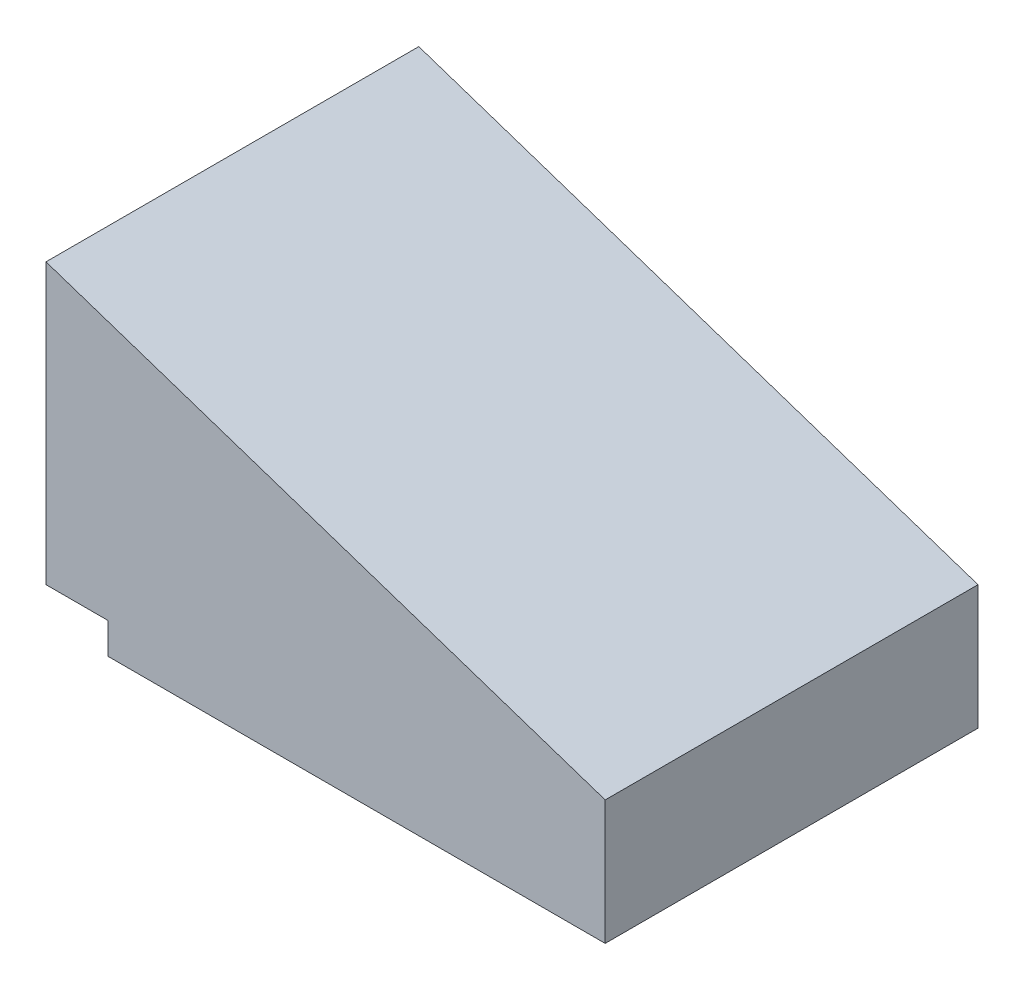
ISO-10303-21;
HEADER;
FILE_DESCRIPTION(('STEP AP214'),'2;1');
FILE_NAME('part.step','',(''),(''),'','','');
FILE_SCHEMA(('AUTOMOTIVE_DESIGN { 1 0 10303 214 1 1 1 1 }'));
ENDSEC;
DATA;
#1=APPLICATION_CONTEXT('core data for automotive mechanical design processes');
#2=APPLICATION_PROTOCOL_DEFINITION('international standard','automotive_design',2000,#1);
#3=PRODUCT_CONTEXT('',#1,'mechanical');
#4=PRODUCT('Part','Part','',(#3));
#5=PRODUCT_RELATED_PRODUCT_CATEGORY('part','',(#4));
#6=PRODUCT_DEFINITION_FORMATION('','',#4);
#7=PRODUCT_DEFINITION_CONTEXT('part definition',#1,'design');
#8=PRODUCT_DEFINITION('design','',#6,#7);
#9=PRODUCT_DEFINITION_SHAPE('','',#8);
#10=(LENGTH_UNIT() NAMED_UNIT(*) SI_UNIT(.MILLI.,.METRE.));
#11=(NAMED_UNIT(*) PLANE_ANGLE_UNIT() SI_UNIT($,.RADIAN.));
#12=(NAMED_UNIT(*) SI_UNIT($,.STERADIAN.) SOLID_ANGLE_UNIT());
#13=UNCERTAINTY_MEASURE_WITH_UNIT(LENGTH_MEASURE(1.E-05),#10,'distance_accuracy_value','');
#14=(GEOMETRIC_REPRESENTATION_CONTEXT(3) GLOBAL_UNCERTAINTY_ASSIGNED_CONTEXT((#13)) GLOBAL_UNIT_ASSIGNED_CONTEXT((#10,
#11,#12)) REPRESENTATION_CONTEXT('',''));
#15=CARTESIAN_POINT('',(0.,0.,0.));
#16=DIRECTION('',(0.,0.,1.));
#17=DIRECTION('',(1.,0.,0.));
#18=AXIS2_PLACEMENT_3D('',#15,#16,#17);
#19=CARTESIAN_POINT('',(0.,0.,152.4));
#20=DIRECTION('',(0.,1.,0.));
#21=DIRECTION('',(-1.,0.,0.));
#22=AXIS2_PLACEMENT_3D('',#19,#20,#21);
#23=PLANE('',#22);
#24=DIRECTION('',(1.,0.,0.));
#25=VECTOR('',#24,1.);
#26=CARTESIAN_POINT('',(0.,0.,152.4));
#27=LINE('',#26,#25);
#28=CARTESIAN_POINT('',(-203.2,0.,152.4));
#29=VERTEX_POINT('',#28);
#30=CARTESIAN_POINT('',(0.,0.,152.4));
#31=VERTEX_POINT('',#30);
#32=EDGE_CURVE('E55',#29,#31,#27,.T.);
#33=ORIENTED_EDGE('',*,*,#32,.F.);
#34=DIRECTION('',(0.,0.,-1.));
#35=VECTOR('',#34,1.);
#36=CARTESIAN_POINT('',(-203.2,0.,152.4));
#37=LINE('',#36,#35);
#38=CARTESIAN_POINT('',(-203.2,0.,150.8125));
#39=VERTEX_POINT('',#38);
#40=EDGE_CURVE('E186',#29,#39,#37,.T.);
#41=ORIENTED_EDGE('',*,*,#40,.T.);
#42=DIRECTION('',(1.,0.,0.));
#43=VECTOR('',#42,1.);
#44=CARTESIAN_POINT('',(0.,0.,150.8125));
#45=LINE('',#44,#43);
#46=CARTESIAN_POINT('',(-1.5875,0.,150.8125));
#47=VERTEX_POINT('',#46);
#48=EDGE_CURVE('E203',#39,#47,#45,.T.);
#49=ORIENTED_EDGE('',*,*,#48,.T.);
#50=DIRECTION('',(0.,0.,-1.));
#51=VECTOR('',#50,1.);
#52=CARTESIAN_POINT('',(-1.5875,0.,152.4));
#53=LINE('',#52,#51);
#54=CARTESIAN_POINT('',(-1.5875,0.,1.5875));
#55=VERTEX_POINT('',#54);
#56=EDGE_CURVE('E204',#47,#55,#53,.T.);
#57=ORIENTED_EDGE('',*,*,#56,.T.);
#58=DIRECTION('',(1.,0.,0.));
#59=VECTOR('',#58,1.);
#60=CARTESIAN_POINT('',(0.,0.,1.58749999999999));
#61=LINE('',#60,#59);
#62=CARTESIAN_POINT('',(-203.2,0.,1.58750000000005));
#63=VERTEX_POINT('',#62);
#64=EDGE_CURVE('E192',#63,#55,#61,.T.);
#65=ORIENTED_EDGE('',*,*,#64,.F.);
#66=CARTESIAN_POINT('',(-203.2,0.,0.));
#67=VERTEX_POINT('',#66);
#68=EDGE_CURVE('E223',#63,#67,#37,.T.);
#69=ORIENTED_EDGE('',*,*,#68,.T.);
#70=DIRECTION('',(1.,0.,0.));
#71=VECTOR('',#70,1.);
#72=CARTESIAN_POINT('',(0.,0.,0.));
#73=LINE('',#72,#71);
#74=CARTESIAN_POINT('',(0.,0.,0.));
#75=VERTEX_POINT('',#74);
#76=EDGE_CURVE('E73',#67,#75,#73,.T.);
#77=ORIENTED_EDGE('',*,*,#76,.T.);
#78=DIRECTION('',(0.,0.,-1.));
#79=VECTOR('',#78,1.);
#80=CARTESIAN_POINT('',(0.,0.,152.4));
#81=LINE('',#80,#79);
#82=EDGE_CURVE('E152',#31,#75,#81,.T.);
#83=ORIENTED_EDGE('',*,*,#82,.F.);
#84=EDGE_LOOP('',(#33,#41,#49,#57,#65,#69,#77,#83));
#85=FACE_BOUND('',#84,.T.);
#86=ADVANCED_FACE('F32',(#85),#23,.F.);
#87=CARTESIAN_POINT('',(0.,0.,152.4));
#88=DIRECTION('',(-1.,0.,0.));
#89=DIRECTION('',(0.,0.,1.));
#90=AXIS2_PLACEMENT_3D('',#87,#88,#89);
#91=PLANE('',#90);
#92=DIRECTION('',(0.,1.,0.));
#93=VECTOR('',#92,1.);
#94=CARTESIAN_POINT('',(0.,0.,0.));
#95=LINE('',#94,#93);
#96=CARTESIAN_POINT('',(0.,50.8,0.));
#97=VERTEX_POINT('',#96);
#98=EDGE_CURVE('E158',#75,#97,#95,.T.);
#99=ORIENTED_EDGE('',*,*,#98,.T.);
#100=DIRECTION('',(0.,0.,-1.));
#101=VECTOR('',#100,1.);
#102=CARTESIAN_POINT('',(0.,50.8,152.4));
#103=LINE('',#102,#101);
#104=CARTESIAN_POINT('',(0.,50.8,152.4));
#105=VERTEX_POINT('',#104);
#106=EDGE_CURVE('E169',#105,#97,#103,.T.);
#107=ORIENTED_EDGE('',*,*,#106,.F.);
#108=DIRECTION('',(0.,1.,0.));
#109=VECTOR('',#108,1.);
#110=CARTESIAN_POINT('',(0.,0.,152.4));
#111=LINE('',#110,#109);
#112=EDGE_CURVE('E154',#31,#105,#111,.T.);
#113=ORIENTED_EDGE('',*,*,#112,.F.);
#114=ORIENTED_EDGE('',*,*,#82,.T.);
#115=EDGE_LOOP('',(#99,#107,#113,#114));
#116=FACE_BOUND('',#115,.T.);
#117=ADVANCED_FACE('F34',(#116),#91,.F.);
#118=CARTESIAN_POINT('',(-228.6,127.,152.4));
#119=DIRECTION('',(-0.316227766016838,-0.948683298050514,0.));
#120=DIRECTION('',(0.948683298050514,-0.316227766016838,0.));
#121=AXIS2_PLACEMENT_3D('',#118,#119,#120);
#122=PLANE('',#121);
#123=DIRECTION('',(-0.948683298050514,0.316227766016838,0.));
#124=VECTOR('',#123,1.);
#125=CARTESIAN_POINT('',(-228.6,127.,0.));
#126=LINE('',#125,#124);
#127=CARTESIAN_POINT('',(-228.6,127.,0.));
#128=VERTEX_POINT('',#127);
#129=EDGE_CURVE('E161',#97,#128,#126,.T.);
#130=ORIENTED_EDGE('',*,*,#129,.T.);
#131=DIRECTION('',(0.,0.,-1.));
#132=VECTOR('',#131,1.);
#133=CARTESIAN_POINT('',(-228.6,127.,152.4));
#134=LINE('',#133,#132);
#135=CARTESIAN_POINT('',(-228.6,127.,152.4));
#136=VERTEX_POINT('',#135);
#137=EDGE_CURVE('E167',#136,#128,#134,.T.);
#138=ORIENTED_EDGE('',*,*,#137,.F.);
#139=DIRECTION('',(-0.948683298050514,0.316227766016838,0.));
#140=VECTOR('',#139,1.);
#141=CARTESIAN_POINT('',(-228.6,127.,152.4));
#142=LINE('',#141,#140);
#143=EDGE_CURVE('E79',#105,#136,#142,.T.);
#144=ORIENTED_EDGE('',*,*,#143,.F.);
#145=ORIENTED_EDGE('',*,*,#106,.T.);
#146=EDGE_LOOP('',(#130,#138,#144,#145));
#147=FACE_BOUND('',#146,.T.);
#148=ADVANCED_FACE('F212',(#147),#122,.F.);
#149=CARTESIAN_POINT('',(-228.6,0.,152.4));
#150=DIRECTION('',(1.,0.,0.));
#151=DIRECTION('',(0.,0.,-1.));
#152=AXIS2_PLACEMENT_3D('',#149,#150,#151);
#153=PLANE('',#152);
#154=DIRECTION('',(0.,-1.,0.));
#155=VECTOR('',#154,1.);
#156=CARTESIAN_POINT('',(-228.6,0.,0.));
#157=LINE('',#156,#155);
#158=CARTESIAN_POINT('',(-228.6,12.7,0.));
#159=VERTEX_POINT('',#158);
#160=EDGE_CURVE('E148',#128,#159,#157,.T.);
#161=ORIENTED_EDGE('',*,*,#160,.T.);
#162=DIRECTION('',(0.,0.,-1.));
#163=VECTOR('',#162,1.);
#164=CARTESIAN_POINT('',(-228.6,12.7,152.4));
#165=LINE('',#164,#163);
#166=CARTESIAN_POINT('',(-228.6,12.7,152.4));
#167=VERTEX_POINT('',#166);
#168=EDGE_CURVE('E132',#167,#159,#165,.T.);
#169=ORIENTED_EDGE('',*,*,#168,.F.);
#170=DIRECTION('',(0.,-1.,0.));
#171=VECTOR('',#170,1.);
#172=CARTESIAN_POINT('',(-228.6,0.,152.4));
#173=LINE('',#172,#171);
#174=EDGE_CURVE('E146',#136,#167,#173,.T.);
#175=ORIENTED_EDGE('',*,*,#174,.F.);
#176=ORIENTED_EDGE('',*,*,#137,.T.);
#177=EDGE_LOOP('',(#161,#169,#175,#176));
#178=FACE_BOUND('',#177,.T.);
#179=ADVANCED_FACE('F144',(#178),#153,.F.);
#180=CARTESIAN_POINT('',(0.,0.,152.4));
#181=DIRECTION('',(0.,0.,1.));
#182=DIRECTION('',(1.,0.,0.));
#183=AXIS2_PLACEMENT_3D('',#180,#181,#182);
#184=PLANE('',#183);
#185=DIRECTION('',(0.,-1.,0.));
#186=VECTOR('',#185,1.);
#187=CARTESIAN_POINT('',(-203.2,0.,152.4));
#188=LINE('',#187,#186);
#189=CARTESIAN_POINT('',(-203.2,12.7,152.4));
#190=VERTEX_POINT('',#189);
#191=EDGE_CURVE('E138',#190,#29,#188,.T.);
#192=ORIENTED_EDGE('',*,*,#191,.T.);
#193=ORIENTED_EDGE('',*,*,#32,.T.);
#194=ORIENTED_EDGE('',*,*,#112,.T.);
#195=ORIENTED_EDGE('',*,*,#143,.T.);
#196=ORIENTED_EDGE('',*,*,#174,.T.);
#197=DIRECTION('',(1.,0.,0.));
#198=VECTOR('',#197,1.);
#199=CARTESIAN_POINT('',(-228.6,12.7,152.4));
#200=LINE('',#199,#198);
#201=EDGE_CURVE('E129',#167,#190,#200,.T.);
#202=ORIENTED_EDGE('',*,*,#201,.T.);
#203=EDGE_LOOP('',(#192,#193,#194,#195,#196,#202));
#204=FACE_BOUND('',#203,.T.);
#205=ADVANCED_FACE('F150',(#204),#184,.T.);
#206=CARTESIAN_POINT('',(0.,0.,0.));
#207=DIRECTION('',(0.,0.,1.));
#208=DIRECTION('',(1.,0.,0.));
#209=AXIS2_PLACEMENT_3D('',#206,#207,#208);
#210=PLANE('',#209);
#211=ORIENTED_EDGE('',*,*,#76,.F.);
#212=DIRECTION('',(0.,-1.,0.));
#213=VECTOR('',#212,1.);
#214=CARTESIAN_POINT('',(-203.2,0.,0.));
#215=LINE('',#214,#213);
#216=CARTESIAN_POINT('',(-203.2,12.7,0.));
#217=VERTEX_POINT('',#216);
#218=EDGE_CURVE('E139',#217,#67,#215,.T.);
#219=ORIENTED_EDGE('',*,*,#218,.F.);
#220=DIRECTION('',(1.,0.,0.));
#221=VECTOR('',#220,1.);
#222=CARTESIAN_POINT('',(-228.6,12.7,0.));
#223=LINE('',#222,#221);
#224=EDGE_CURVE('E216',#159,#217,#223,.T.);
#225=ORIENTED_EDGE('',*,*,#224,.F.);
#226=ORIENTED_EDGE('',*,*,#160,.F.);
#227=ORIENTED_EDGE('',*,*,#129,.F.);
#228=ORIENTED_EDGE('',*,*,#98,.F.);
#229=EDGE_LOOP('',(#211,#219,#225,#226,#227,#228));
#230=FACE_BOUND('',#229,.T.);
#231=ADVANCED_FACE('F214',(#230),#210,.F.);
#232=CARTESIAN_POINT('',(-1.5875,0.,152.4));
#233=DIRECTION('',(-1.,0.,0.));
#234=DIRECTION('',(0.,0.,1.));
#235=AXIS2_PLACEMENT_3D('',#232,#233,#234);
#236=PLANE('',#235);
#237=DIRECTION('',(0.,1.,0.));
#238=VECTOR('',#237,1.);
#239=CARTESIAN_POINT('',(-1.5875,0.,1.58749999999999));
#240=LINE('',#239,#238);
#241=CARTESIAN_POINT('',(-1.5875,49.6557947381609,1.5875));
#242=VERTEX_POINT('',#241);
#243=EDGE_CURVE('E196',#55,#242,#240,.T.);
#244=ORIENTED_EDGE('',*,*,#243,.F.);
#245=ORIENTED_EDGE('',*,*,#56,.F.);
#246=DIRECTION('',(0.,1.,0.));
#247=VECTOR('',#246,1.);
#248=CARTESIAN_POINT('',(-1.5875,0.,150.8125));
#249=LINE('',#248,#247);
#250=CARTESIAN_POINT('',(-1.5875,49.6557947381609,150.8125));
#251=VERTEX_POINT('',#250);
#252=EDGE_CURVE('E194',#47,#251,#249,.T.);
#253=ORIENTED_EDGE('',*,*,#252,.T.);
#254=DIRECTION('',(0.,0.,-1.));
#255=VECTOR('',#254,1.);
#256=CARTESIAN_POINT('',(-1.58749999999999,49.6557947381609,152.4));
#257=LINE('',#256,#255);
#258=EDGE_CURVE('E162',#251,#242,#257,.T.);
#259=ORIENTED_EDGE('',*,*,#258,.T.);
#260=EDGE_LOOP('',(#244,#245,#253,#259));
#261=FACE_BOUND('',#260,.T.);
#262=ADVANCED_FACE('F245',(#261),#236,.T.);
#263=CARTESIAN_POINT('',(-229.102011578552,125.493965264345,152.4));
#264=DIRECTION('',(-0.316227766016838,-0.948683298050514,0.));
#265=DIRECTION('',(0.948683298050514,-0.316227766016838,0.));
#266=AXIS2_PLACEMENT_3D('',#263,#264,#265);
#267=PLANE('',#266);
#268=DIRECTION('',(-0.948683298050514,0.316227766016838,0.));
#269=VECTOR('',#268,1.);
#270=CARTESIAN_POINT('',(-229.102011578552,125.493965264345,1.58749999999999));
#271=LINE('',#270,#269);
#272=CARTESIAN_POINT('',(-227.0125,124.797461404828,1.5875));
#273=VERTEX_POINT('',#272);
#274=EDGE_CURVE('E190',#242,#273,#271,.T.);
#275=ORIENTED_EDGE('',*,*,#274,.F.);
#276=ORIENTED_EDGE('',*,*,#258,.F.);
#277=DIRECTION('',(-0.948683298050514,0.316227766016838,0.));
#278=VECTOR('',#277,1.);
#279=CARTESIAN_POINT('',(-229.102011578552,125.493965264345,150.8125));
#280=LINE('',#279,#278);
#281=CARTESIAN_POINT('',(-227.0125,124.797461404828,150.8125));
#282=VERTEX_POINT('',#281);
#283=EDGE_CURVE('E200',#251,#282,#280,.T.);
#284=ORIENTED_EDGE('',*,*,#283,.T.);
#285=DIRECTION('',(0.,0.,-1.));
#286=VECTOR('',#285,1.);
#287=CARTESIAN_POINT('',(-227.0125,124.797461404828,152.4));
#288=LINE('',#287,#286);
#289=EDGE_CURVE('E207',#282,#273,#288,.T.);
#290=ORIENTED_EDGE('',*,*,#289,.T.);
#291=EDGE_LOOP('',(#275,#276,#284,#290));
#292=FACE_BOUND('',#291,.T.);
#293=ADVANCED_FACE('F234',(#292),#267,.T.);
#294=CARTESIAN_POINT('',(-227.0125,0.,152.4));
#295=DIRECTION('',(1.,0.,0.));
#296=DIRECTION('',(0.,0.,-1.));
#297=AXIS2_PLACEMENT_3D('',#294,#295,#296);
#298=PLANE('',#297);
#299=DIRECTION('',(0.,0.,1.));
#300=VECTOR('',#299,1.);
#301=CARTESIAN_POINT('',(-227.0125,12.7,152.4));
#302=LINE('',#301,#300);
#303=CARTESIAN_POINT('',(-227.0125,12.7,1.5875));
#304=VERTEX_POINT('',#303);
#305=CARTESIAN_POINT('',(-227.0125,12.7,150.8125));
#306=VERTEX_POINT('',#305);
#307=EDGE_CURVE('E172',#304,#306,#302,.T.);
#308=ORIENTED_EDGE('',*,*,#307,.F.);
#309=DIRECTION('',(0.,-1.,0.));
#310=VECTOR('',#309,1.);
#311=CARTESIAN_POINT('',(-227.0125,0.,1.58749999999999));
#312=LINE('',#311,#310);
#313=EDGE_CURVE('E182',#273,#304,#312,.T.);
#314=ORIENTED_EDGE('',*,*,#313,.F.);
#315=ORIENTED_EDGE('',*,*,#289,.F.);
#316=DIRECTION('',(0.,-1.,0.));
#317=VECTOR('',#316,1.);
#318=CARTESIAN_POINT('',(-227.0125,0.,150.8125));
#319=LINE('',#318,#317);
#320=EDGE_CURVE('E184',#282,#306,#319,.T.);
#321=ORIENTED_EDGE('',*,*,#320,.T.);
#322=EDGE_LOOP('',(#308,#314,#315,#321));
#323=FACE_BOUND('',#322,.T.);
#324=ADVANCED_FACE('F180',(#323),#298,.T.);
#325=CARTESIAN_POINT('',(0.,0.,150.8125));
#326=DIRECTION('',(0.,0.,1.));
#327=DIRECTION('',(1.,0.,0.));
#328=AXIS2_PLACEMENT_3D('',#325,#326,#327);
#329=PLANE('',#328);
#330=ORIENTED_EDGE('',*,*,#48,.F.);
#331=DIRECTION('',(0.,1.,0.));
#332=VECTOR('',#331,1.);
#333=CARTESIAN_POINT('',(-203.2,0.,150.8125));
#334=LINE('',#333,#332);
#335=CARTESIAN_POINT('',(-203.2,12.7,150.8125));
#336=VERTEX_POINT('',#335);
#337=EDGE_CURVE('E226',#39,#336,#334,.T.);
#338=ORIENTED_EDGE('',*,*,#337,.T.);
#339=DIRECTION('',(-1.,0.,0.));
#340=VECTOR('',#339,1.);
#341=CARTESIAN_POINT('',(0.,12.7,150.8125));
#342=LINE('',#341,#340);
#343=EDGE_CURVE('E185',#336,#306,#342,.T.);
#344=ORIENTED_EDGE('',*,*,#343,.T.);
#345=ORIENTED_EDGE('',*,*,#320,.F.);
#346=ORIENTED_EDGE('',*,*,#283,.F.);
#347=ORIENTED_EDGE('',*,*,#252,.F.);
#348=EDGE_LOOP('',(#330,#338,#344,#345,#346,#347));
#349=FACE_BOUND('',#348,.T.);
#350=ADVANCED_FACE('F238',(#349),#329,.F.);
#351=CARTESIAN_POINT('',(0.,0.,1.5875));
#352=DIRECTION('',(0.,0.,1.));
#353=DIRECTION('',(1.,0.,0.));
#354=AXIS2_PLACEMENT_3D('',#351,#352,#353);
#355=PLANE('',#354);
#356=DIRECTION('',(0.,1.,0.));
#357=VECTOR('',#356,1.);
#358=CARTESIAN_POINT('',(-203.2,0.,1.5875));
#359=LINE('',#358,#357);
#360=CARTESIAN_POINT('',(-203.2,12.7,1.5875));
#361=VERTEX_POINT('',#360);
#362=EDGE_CURVE('E11',#63,#361,#359,.T.);
#363=ORIENTED_EDGE('',*,*,#362,.F.);
#364=ORIENTED_EDGE('',*,*,#64,.T.);
#365=ORIENTED_EDGE('',*,*,#243,.T.);
#366=ORIENTED_EDGE('',*,*,#274,.T.);
#367=ORIENTED_EDGE('',*,*,#313,.T.);
#368=DIRECTION('',(-1.,0.,0.));
#369=VECTOR('',#368,1.);
#370=CARTESIAN_POINT('',(0.,12.7,1.5875));
#371=LINE('',#370,#369);
#372=EDGE_CURVE('E40',#361,#304,#371,.T.);
#373=ORIENTED_EDGE('',*,*,#372,.F.);
#374=EDGE_LOOP('',(#363,#364,#365,#366,#367,#373));
#375=FACE_BOUND('',#374,.T.);
#376=ADVANCED_FACE('F188',(#375),#355,.T.);
#377=CARTESIAN_POINT('',(-203.2,0.,152.4));
#378=DIRECTION('',(1.,0.,0.));
#379=DIRECTION('',(0.,0.,-1.));
#380=AXIS2_PLACEMENT_3D('',#377,#378,#379);
#381=PLANE('',#380);
#382=ORIENTED_EDGE('',*,*,#40,.F.);
#383=ORIENTED_EDGE('',*,*,#191,.F.);
#384=DIRECTION('',(0.,0.,-1.));
#385=VECTOR('',#384,1.);
#386=CARTESIAN_POINT('',(-203.2,12.7,152.4));
#387=LINE('',#386,#385);
#388=EDGE_CURVE('E135',#190,#336,#387,.T.);
#389=ORIENTED_EDGE('',*,*,#388,.T.);
#390=ORIENTED_EDGE('',*,*,#337,.F.);
#391=EDGE_LOOP('',(#382,#383,#389,#390));
#392=FACE_BOUND('',#391,.T.);
#393=ADVANCED_FACE('F241',(#392),#381,.F.);
#394=CARTESIAN_POINT('',(-228.6,12.7,152.4));
#395=DIRECTION('',(0.,1.,0.));
#396=DIRECTION('',(-1.,0.,0.));
#397=AXIS2_PLACEMENT_3D('',#394,#395,#396);
#398=PLANE('',#397);
#399=ORIENTED_EDGE('',*,*,#388,.F.);
#400=ORIENTED_EDGE('',*,*,#201,.F.);
#401=ORIENTED_EDGE('',*,*,#168,.T.);
#402=ORIENTED_EDGE('',*,*,#224,.T.);
#403=EDGE_CURVE('E47',#361,#217,#387,.T.);
#404=ORIENTED_EDGE('',*,*,#403,.F.);
#405=ORIENTED_EDGE('',*,*,#372,.T.);
#406=ORIENTED_EDGE('',*,*,#307,.T.);
#407=ORIENTED_EDGE('',*,*,#343,.F.);
#408=EDGE_LOOP('',(#399,#400,#401,#402,#404,#405,#406,#407));
#409=FACE_BOUND('',#408,.T.);
#410=ADVANCED_FACE('F131',(#409),#398,.F.);
#411=ORIENTED_EDGE('',*,*,#362,.T.);
#412=ORIENTED_EDGE('',*,*,#403,.T.);
#413=ORIENTED_EDGE('',*,*,#218,.T.);
#414=ORIENTED_EDGE('',*,*,#68,.F.);
#415=EDGE_LOOP('',(#411,#412,#413,#414));
#416=FACE_BOUND('',#415,.T.);
#417=ADVANCED_FACE('F248',(#416),#381,.F.);
#418=CLOSED_SHELL('',(#86,#117,#148,#179,#205,#231,#262,#293,#324,#350,#376,#393,#410,#417));
#419=MANIFOLD_SOLID_BREP('B2',#418);
#420=ADVANCED_BREP_SHAPE_REPRESENTATION('',(#18,#419),#14);
#421=SHAPE_DEFINITION_REPRESENTATION(#9,#420);
ENDSEC;
END-ISO-10303-21;
